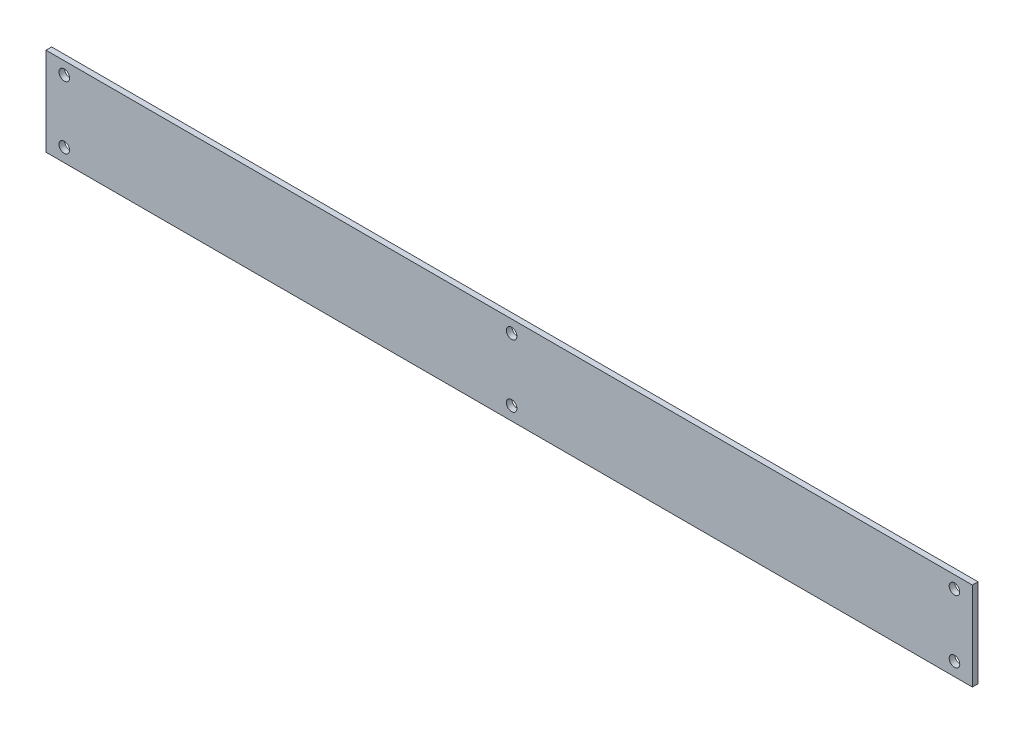
ISO-10303-21;
HEADER;
FILE_DESCRIPTION(('STEP AP214'),'2;1');
FILE_NAME('part.step','',(''),(''),'','','');
FILE_SCHEMA(('AUTOMOTIVE_DESIGN { 1 0 10303 214 1 1 1 1 }'));
ENDSEC;
DATA;
#1=APPLICATION_CONTEXT('core data for automotive mechanical design processes');
#2=APPLICATION_PROTOCOL_DEFINITION('international standard','automotive_design',2000,#1);
#3=PRODUCT_CONTEXT('',#1,'mechanical');
#4=PRODUCT('Part','Part','',(#3));
#5=PRODUCT_RELATED_PRODUCT_CATEGORY('part','',(#4));
#6=PRODUCT_DEFINITION_FORMATION('','',#4);
#7=PRODUCT_DEFINITION_CONTEXT('part definition',#1,'design');
#8=PRODUCT_DEFINITION('design','',#6,#7);
#9=PRODUCT_DEFINITION_SHAPE('','',#8);
#10=(LENGTH_UNIT() NAMED_UNIT(*) SI_UNIT(.MILLI.,.METRE.));
#11=(NAMED_UNIT(*) PLANE_ANGLE_UNIT() SI_UNIT($,.RADIAN.));
#12=(NAMED_UNIT(*) SI_UNIT($,.STERADIAN.) SOLID_ANGLE_UNIT());
#13=UNCERTAINTY_MEASURE_WITH_UNIT(LENGTH_MEASURE(1.E-05),#10,'distance_accuracy_value','');
#14=(GEOMETRIC_REPRESENTATION_CONTEXT(3) GLOBAL_UNCERTAINTY_ASSIGNED_CONTEXT((#13)) GLOBAL_UNIT_ASSIGNED_CONTEXT((#10,
#11,#12)) REPRESENTATION_CONTEXT('',''));
#15=CARTESIAN_POINT('',(0.,0.,0.));
#16=DIRECTION('',(0.,0.,1.));
#17=DIRECTION('',(1.,0.,0.));
#18=AXIS2_PLACEMENT_3D('',#15,#16,#17);
#19=CARTESIAN_POINT('',(-131.5,-12.55,1.6));
#20=DIRECTION('',(1.,0.,0.));
#21=DIRECTION('',(0.,0.,-1.));
#22=AXIS2_PLACEMENT_3D('',#19,#20,#21);
#23=PLANE('',#22);
#24=DIRECTION('',(0.,-1.,0.));
#25=VECTOR('',#24,1.);
#26=CARTESIAN_POINT('',(-131.5,-12.55,0.));
#27=LINE('',#26,#25);
#28=CARTESIAN_POINT('',(-131.5,12.55,0.));
#29=VERTEX_POINT('',#28);
#30=CARTESIAN_POINT('',(-131.5,-12.55,0.));
#31=VERTEX_POINT('',#30);
#32=EDGE_CURVE('E98',#29,#31,#27,.T.);
#33=ORIENTED_EDGE('',*,*,#32,.T.);
#34=DIRECTION('',(0.,0.,-1.));
#35=VECTOR('',#34,1.);
#36=CARTESIAN_POINT('',(-131.5,-12.55,1.6));
#37=LINE('',#36,#35);
#38=CARTESIAN_POINT('',(-131.5,-12.55,1.6));
#39=VERTEX_POINT('',#38);
#40=EDGE_CURVE('E11',#39,#31,#37,.T.);
#41=ORIENTED_EDGE('',*,*,#40,.F.);
#42=DIRECTION('',(0.,-1.,0.));
#43=VECTOR('',#42,1.);
#44=CARTESIAN_POINT('',(-131.5,-12.55,1.6));
#45=LINE('',#44,#43);
#46=CARTESIAN_POINT('',(-131.5,12.55,1.6));
#47=VERTEX_POINT('',#46);
#48=EDGE_CURVE('E86',#47,#39,#45,.T.);
#49=ORIENTED_EDGE('',*,*,#48,.F.);
#50=DIRECTION('',(0.,0.,-1.));
#51=VECTOR('',#50,1.);
#52=CARTESIAN_POINT('',(-131.5,12.55,1.6));
#53=LINE('',#52,#51);
#54=EDGE_CURVE('E94',#47,#29,#53,.T.);
#55=ORIENTED_EDGE('',*,*,#54,.T.);
#56=EDGE_LOOP('',(#33,#41,#49,#55));
#57=FACE_BOUND('',#56,.T.);
#58=ADVANCED_FACE('F35',(#57),#23,.F.);
#59=CARTESIAN_POINT('',(131.5,-12.55,1.6));
#60=DIRECTION('',(0.,1.,0.));
#61=DIRECTION('',(-1.,0.,0.));
#62=AXIS2_PLACEMENT_3D('',#59,#60,#61);
#63=PLANE('',#62);
#64=DIRECTION('',(1.,0.,0.));
#65=VECTOR('',#64,1.);
#66=CARTESIAN_POINT('',(131.5,-12.55,0.));
#67=LINE('',#66,#65);
#68=CARTESIAN_POINT('',(131.5,-12.55,0.));
#69=VERTEX_POINT('',#68);
#70=EDGE_CURVE('E90',#31,#69,#67,.T.);
#71=ORIENTED_EDGE('',*,*,#70,.T.);
#72=DIRECTION('',(0.,0.,-1.));
#73=VECTOR('',#72,1.);
#74=CARTESIAN_POINT('',(131.5,-12.55,1.6));
#75=LINE('',#74,#73);
#76=CARTESIAN_POINT('',(131.5,-12.55,1.6));
#77=VERTEX_POINT('',#76);
#78=EDGE_CURVE('E43',#77,#69,#75,.T.);
#79=ORIENTED_EDGE('',*,*,#78,.F.);
#80=DIRECTION('',(1.,0.,0.));
#81=VECTOR('',#80,1.);
#82=CARTESIAN_POINT('',(131.5,-12.55,1.6));
#83=LINE('',#82,#81);
#84=EDGE_CURVE('E81',#39,#77,#83,.T.);
#85=ORIENTED_EDGE('',*,*,#84,.F.);
#86=ORIENTED_EDGE('',*,*,#40,.T.);
#87=EDGE_LOOP('',(#71,#79,#85,#86));
#88=FACE_BOUND('',#87,.T.);
#89=ADVANCED_FACE('F89',(#88),#63,.F.);
#90=CARTESIAN_POINT('',(131.5,-12.55,1.6));
#91=DIRECTION('',(-1.,0.,0.));
#92=DIRECTION('',(0.,0.,1.));
#93=AXIS2_PLACEMENT_3D('',#90,#91,#92);
#94=PLANE('',#93);
#95=DIRECTION('',(0.,1.,0.));
#96=VECTOR('',#95,1.);
#97=CARTESIAN_POINT('',(131.5,-12.55,0.));
#98=LINE('',#97,#96);
#99=CARTESIAN_POINT('',(131.5,12.55,0.));
#100=VERTEX_POINT('',#99);
#101=EDGE_CURVE('E68',#69,#100,#98,.T.);
#102=ORIENTED_EDGE('',*,*,#101,.T.);
#103=DIRECTION('',(0.,0.,-1.));
#104=VECTOR('',#103,1.);
#105=CARTESIAN_POINT('',(131.5,12.55,1.6));
#106=LINE('',#105,#104);
#107=CARTESIAN_POINT('',(131.5,12.55,1.6));
#108=VERTEX_POINT('',#107);
#109=EDGE_CURVE('E91',#108,#100,#106,.T.);
#110=ORIENTED_EDGE('',*,*,#109,.F.);
#111=DIRECTION('',(0.,1.,0.));
#112=VECTOR('',#111,1.);
#113=CARTESIAN_POINT('',(131.5,-12.55,1.6));
#114=LINE('',#113,#112);
#115=EDGE_CURVE('E84',#77,#108,#114,.T.);
#116=ORIENTED_EDGE('',*,*,#115,.F.);
#117=ORIENTED_EDGE('',*,*,#78,.T.);
#118=EDGE_LOOP('',(#102,#110,#116,#117));
#119=FACE_BOUND('',#118,.T.);
#120=ADVANCED_FACE('F92',(#119),#94,.F.);
#121=CARTESIAN_POINT('',(131.5,12.55,1.6));
#122=DIRECTION('',(0.,-1.,0.));
#123=DIRECTION('',(1.,0.,0.));
#124=AXIS2_PLACEMENT_3D('',#121,#122,#123);
#125=PLANE('',#124);
#126=DIRECTION('',(-1.,0.,0.));
#127=VECTOR('',#126,1.);
#128=CARTESIAN_POINT('',(131.5,12.55,0.));
#129=LINE('',#128,#127);
#130=EDGE_CURVE('E74',#100,#29,#129,.T.);
#131=ORIENTED_EDGE('',*,*,#130,.T.);
#132=ORIENTED_EDGE('',*,*,#54,.F.);
#133=DIRECTION('',(-1.,0.,0.));
#134=VECTOR('',#133,1.);
#135=CARTESIAN_POINT('',(131.5,12.55,1.6));
#136=LINE('',#135,#134);
#137=EDGE_CURVE('E51',#108,#47,#136,.T.);
#138=ORIENTED_EDGE('',*,*,#137,.F.);
#139=ORIENTED_EDGE('',*,*,#109,.T.);
#140=EDGE_LOOP('',(#131,#132,#138,#139));
#141=FACE_BOUND('',#140,.T.);
#142=ADVANCED_FACE('F106',(#141),#125,.F.);
#143=CARTESIAN_POINT('',(0.,0.,1.6));
#144=DIRECTION('',(0.,0.,1.));
#145=DIRECTION('',(1.,0.,0.));
#146=AXIS2_PLACEMENT_3D('',#143,#144,#145);
#147=PLANE('',#146);
#148=CARTESIAN_POINT('',(-126.31,9.03999999999995,1.6));
#149=DIRECTION('',(0.,0.,1.));
#150=DIRECTION('',(1.,0.,0.));
#151=AXIS2_PLACEMENT_3D('',#148,#149,#150);
#152=CIRCLE('',#151,1.5);
#153=CARTESIAN_POINT('',(-124.81,9.03999999999995,1.6));
#154=VERTEX_POINT('',#153);
#155=EDGE_CURVE('E142',#154,#154,#152,.T.);
#156=ORIENTED_EDGE('',*,*,#155,.F.);
#157=EDGE_LOOP('',(#156));
#158=FACE_BOUND('',#157,.T.);
#159=CARTESIAN_POINT('',(0.690000000000024,9.03999999999997,1.6));
#160=DIRECTION('',(0.,0.,1.));
#161=DIRECTION('',(1.,0.,0.));
#162=AXIS2_PLACEMENT_3D('',#159,#160,#161);
#163=CIRCLE('',#162,1.5);
#164=CARTESIAN_POINT('',(2.19000000000002,9.03999999999997,1.6));
#165=VERTEX_POINT('',#164);
#166=EDGE_CURVE('E136',#165,#165,#163,.T.);
#167=ORIENTED_EDGE('',*,*,#166,.F.);
#168=EDGE_LOOP('',(#167));
#169=FACE_BOUND('',#168,.T.);
#170=CARTESIAN_POINT('',(-126.31,-8.74000000000005,1.6));
#171=DIRECTION('',(0.,0.,1.));
#172=DIRECTION('',(1.,0.,0.));
#173=AXIS2_PLACEMENT_3D('',#170,#171,#172);
#174=CIRCLE('',#173,1.5);
#175=CARTESIAN_POINT('',(-124.81,-8.74000000000005,1.6));
#176=VERTEX_POINT('',#175);
#177=EDGE_CURVE('E130',#176,#176,#174,.T.);
#178=ORIENTED_EDGE('',*,*,#177,.F.);
#179=EDGE_LOOP('',(#178));
#180=FACE_BOUND('',#179,.T.);
#181=CARTESIAN_POINT('',(0.690000000000024,-8.74000000000003,1.6));
#182=DIRECTION('',(0.,0.,1.));
#183=DIRECTION('',(1.,0.,0.));
#184=AXIS2_PLACEMENT_3D('',#181,#182,#183);
#185=CIRCLE('',#184,1.5);
#186=CARTESIAN_POINT('',(2.19000000000002,-8.74000000000003,1.6));
#187=VERTEX_POINT('',#186);
#188=EDGE_CURVE('E124',#187,#187,#185,.T.);
#189=ORIENTED_EDGE('',*,*,#188,.F.);
#190=EDGE_LOOP('',(#189));
#191=FACE_BOUND('',#190,.T.);
#192=CARTESIAN_POINT('',(126.42,9.03999999999998,1.6));
#193=DIRECTION('',(0.,0.,1.));
#194=DIRECTION('',(1.,0.,0.));
#195=AXIS2_PLACEMENT_3D('',#192,#193,#194);
#196=CIRCLE('',#195,1.5);
#197=CARTESIAN_POINT('',(127.92,9.03999999999998,1.6));
#198=VERTEX_POINT('',#197);
#199=EDGE_CURVE('E118',#198,#198,#196,.T.);
#200=ORIENTED_EDGE('',*,*,#199,.F.);
#201=EDGE_LOOP('',(#200));
#202=FACE_BOUND('',#201,.T.);
#203=CARTESIAN_POINT('',(126.42,-8.74000000000001,1.6));
#204=DIRECTION('',(0.,0.,1.));
#205=DIRECTION('',(1.,0.,0.));
#206=AXIS2_PLACEMENT_3D('',#203,#204,#205);
#207=CIRCLE('',#206,1.5);
#208=CARTESIAN_POINT('',(127.92,-8.74000000000001,1.6));
#209=VERTEX_POINT('',#208);
#210=EDGE_CURVE('E112',#209,#209,#207,.T.);
#211=ORIENTED_EDGE('',*,*,#210,.F.);
#212=EDGE_LOOP('',(#211));
#213=FACE_BOUND('',#212,.T.);
#214=ORIENTED_EDGE('',*,*,#48,.T.);
#215=ORIENTED_EDGE('',*,*,#84,.T.);
#216=ORIENTED_EDGE('',*,*,#115,.T.);
#217=ORIENTED_EDGE('',*,*,#137,.T.);
#218=EDGE_LOOP('',(#214,#215,#216,#217));
#219=FACE_BOUND('',#218,.T.);
#220=ADVANCED_FACE('F82',(#158,#169,#180,#191,#202,#213,#219),#147,.T.);
#221=CARTESIAN_POINT('',(0.,0.,0.));
#222=DIRECTION('',(0.,0.,1.));
#223=DIRECTION('',(1.,0.,0.));
#224=AXIS2_PLACEMENT_3D('',#221,#222,#223);
#225=PLANE('',#224);
#226=CARTESIAN_POINT('',(-126.31,9.03999999999995,0.));
#227=DIRECTION('',(0.,0.,1.));
#228=DIRECTION('',(1.,0.,0.));
#229=AXIS2_PLACEMENT_3D('',#226,#227,#228);
#230=CIRCLE('',#229,1.5);
#231=CARTESIAN_POINT('',(-124.81,9.03999999999995,0.));
#232=VERTEX_POINT('',#231);
#233=EDGE_CURVE('E139',#232,#232,#230,.T.);
#234=ORIENTED_EDGE('',*,*,#233,.T.);
#235=EDGE_LOOP('',(#234));
#236=FACE_BOUND('',#235,.T.);
#237=CARTESIAN_POINT('',(0.690000000000024,9.03999999999997,0.));
#238=DIRECTION('',(0.,0.,1.));
#239=DIRECTION('',(1.,0.,0.));
#240=AXIS2_PLACEMENT_3D('',#237,#238,#239);
#241=CIRCLE('',#240,1.5);
#242=CARTESIAN_POINT('',(2.19000000000002,9.03999999999997,0.));
#243=VERTEX_POINT('',#242);
#244=EDGE_CURVE('E133',#243,#243,#241,.T.);
#245=ORIENTED_EDGE('',*,*,#244,.T.);
#246=EDGE_LOOP('',(#245));
#247=FACE_BOUND('',#246,.T.);
#248=CARTESIAN_POINT('',(-126.31,-8.74000000000005,0.));
#249=DIRECTION('',(0.,0.,1.));
#250=DIRECTION('',(1.,0.,0.));
#251=AXIS2_PLACEMENT_3D('',#248,#249,#250);
#252=CIRCLE('',#251,1.5);
#253=CARTESIAN_POINT('',(-124.81,-8.74000000000005,0.));
#254=VERTEX_POINT('',#253);
#255=EDGE_CURVE('E127',#254,#254,#252,.T.);
#256=ORIENTED_EDGE('',*,*,#255,.T.);
#257=EDGE_LOOP('',(#256));
#258=FACE_BOUND('',#257,.T.);
#259=CARTESIAN_POINT('',(0.690000000000024,-8.74000000000003,0.));
#260=DIRECTION('',(0.,0.,1.));
#261=DIRECTION('',(1.,0.,0.));
#262=AXIS2_PLACEMENT_3D('',#259,#260,#261);
#263=CIRCLE('',#262,1.5);
#264=CARTESIAN_POINT('',(2.19000000000002,-8.74000000000003,0.));
#265=VERTEX_POINT('',#264);
#266=EDGE_CURVE('E121',#265,#265,#263,.T.);
#267=ORIENTED_EDGE('',*,*,#266,.T.);
#268=EDGE_LOOP('',(#267));
#269=FACE_BOUND('',#268,.T.);
#270=CARTESIAN_POINT('',(126.42,9.03999999999998,0.));
#271=DIRECTION('',(0.,0.,1.));
#272=DIRECTION('',(1.,0.,0.));
#273=AXIS2_PLACEMENT_3D('',#270,#271,#272);
#274=CIRCLE('',#273,1.5);
#275=CARTESIAN_POINT('',(127.92,9.03999999999998,0.));
#276=VERTEX_POINT('',#275);
#277=EDGE_CURVE('E115',#276,#276,#274,.T.);
#278=ORIENTED_EDGE('',*,*,#277,.T.);
#279=EDGE_LOOP('',(#278));
#280=FACE_BOUND('',#279,.T.);
#281=CARTESIAN_POINT('',(126.42,-8.74000000000001,0.));
#282=DIRECTION('',(0.,0.,1.));
#283=DIRECTION('',(1.,0.,0.));
#284=AXIS2_PLACEMENT_3D('',#281,#282,#283);
#285=CIRCLE('',#284,1.5);
#286=CARTESIAN_POINT('',(127.92,-8.74000000000001,0.));
#287=VERTEX_POINT('',#286);
#288=EDGE_CURVE('E101',#287,#287,#285,.T.);
#289=ORIENTED_EDGE('',*,*,#288,.T.);
#290=EDGE_LOOP('',(#289));
#291=FACE_BOUND('',#290,.T.);
#292=ORIENTED_EDGE('',*,*,#32,.F.);
#293=ORIENTED_EDGE('',*,*,#130,.F.);
#294=ORIENTED_EDGE('',*,*,#101,.F.);
#295=ORIENTED_EDGE('',*,*,#70,.F.);
#296=EDGE_LOOP('',(#292,#293,#294,#295));
#297=FACE_BOUND('',#296,.T.);
#298=ADVANCED_FACE('F109',(#236,#247,#258,#269,#280,#291,#297),#225,.F.);
#299=CARTESIAN_POINT('',(126.42,-8.74000000000001,0.));
#300=DIRECTION('',(0.,0.,1.));
#301=DIRECTION('',(1.,0.,0.));
#302=AXIS2_PLACEMENT_3D('',#299,#300,#301);
#303=CYLINDRICAL_SURFACE('',#302,1.5);
#304=ORIENTED_EDGE('',*,*,#288,.F.);
#305=EDGE_LOOP('',(#304));
#306=FACE_BOUND('',#305,.T.);
#307=ORIENTED_EDGE('',*,*,#210,.T.);
#308=EDGE_LOOP('',(#307));
#309=FACE_BOUND('',#308,.T.);
#310=ADVANCED_FACE('F170',(#306,#309),#303,.F.);
#311=CARTESIAN_POINT('',(126.42,9.03999999999998,0.));
#312=DIRECTION('',(0.,0.,1.));
#313=DIRECTION('',(1.,0.,0.));
#314=AXIS2_PLACEMENT_3D('',#311,#312,#313);
#315=CYLINDRICAL_SURFACE('',#314,1.5);
#316=ORIENTED_EDGE('',*,*,#277,.F.);
#317=EDGE_LOOP('',(#316));
#318=FACE_BOUND('',#317,.T.);
#319=ORIENTED_EDGE('',*,*,#199,.T.);
#320=EDGE_LOOP('',(#319));
#321=FACE_BOUND('',#320,.T.);
#322=ADVANCED_FACE('F172',(#318,#321),#315,.F.);
#323=CARTESIAN_POINT('',(0.690000000000024,-8.74000000000003,0.));
#324=DIRECTION('',(0.,0.,1.));
#325=DIRECTION('',(1.,0.,0.));
#326=AXIS2_PLACEMENT_3D('',#323,#324,#325);
#327=CYLINDRICAL_SURFACE('',#326,1.5);
#328=ORIENTED_EDGE('',*,*,#266,.F.);
#329=EDGE_LOOP('',(#328));
#330=FACE_BOUND('',#329,.T.);
#331=ORIENTED_EDGE('',*,*,#188,.T.);
#332=EDGE_LOOP('',(#331));
#333=FACE_BOUND('',#332,.T.);
#334=ADVANCED_FACE('F179',(#330,#333),#327,.F.);
#335=CARTESIAN_POINT('',(-126.31,-8.74000000000005,0.));
#336=DIRECTION('',(0.,0.,1.));
#337=DIRECTION('',(1.,0.,0.));
#338=AXIS2_PLACEMENT_3D('',#335,#336,#337);
#339=CYLINDRICAL_SURFACE('',#338,1.5);
#340=ORIENTED_EDGE('',*,*,#255,.F.);
#341=EDGE_LOOP('',(#340));
#342=FACE_BOUND('',#341,.T.);
#343=ORIENTED_EDGE('',*,*,#177,.T.);
#344=EDGE_LOOP('',(#343));
#345=FACE_BOUND('',#344,.T.);
#346=ADVANCED_FACE('F227',(#342,#345),#339,.F.);
#347=CARTESIAN_POINT('',(0.690000000000024,9.03999999999997,0.));
#348=DIRECTION('',(0.,0.,1.));
#349=DIRECTION('',(1.,0.,0.));
#350=AXIS2_PLACEMENT_3D('',#347,#348,#349);
#351=CYLINDRICAL_SURFACE('',#350,1.5);
#352=ORIENTED_EDGE('',*,*,#244,.F.);
#353=EDGE_LOOP('',(#352));
#354=FACE_BOUND('',#353,.T.);
#355=ORIENTED_EDGE('',*,*,#166,.T.);
#356=EDGE_LOOP('',(#355));
#357=FACE_BOUND('',#356,.T.);
#358=ADVANCED_FACE('F153',(#354,#357),#351,.F.);
#359=CARTESIAN_POINT('',(-126.31,9.03999999999995,0.));
#360=DIRECTION('',(0.,0.,1.));
#361=DIRECTION('',(1.,0.,0.));
#362=AXIS2_PLACEMENT_3D('',#359,#360,#361);
#363=CYLINDRICAL_SURFACE('',#362,1.5);
#364=ORIENTED_EDGE('',*,*,#233,.F.);
#365=EDGE_LOOP('',(#364));
#366=FACE_BOUND('',#365,.T.);
#367=ORIENTED_EDGE('',*,*,#155,.T.);
#368=EDGE_LOOP('',(#367));
#369=FACE_BOUND('',#368,.T.);
#370=ADVANCED_FACE('F150',(#366,#369),#363,.F.);
#371=CLOSED_SHELL('',(#58,#89,#120,#142,#220,#298,#310,#322,#334,#346,#358,#370));
#372=MANIFOLD_SOLID_BREP('B2',#371);
#373=ADVANCED_BREP_SHAPE_REPRESENTATION('',(#18,#372),#14);
#374=SHAPE_DEFINITION_REPRESENTATION(#9,#373);
ENDSEC;
END-ISO-10303-21;
